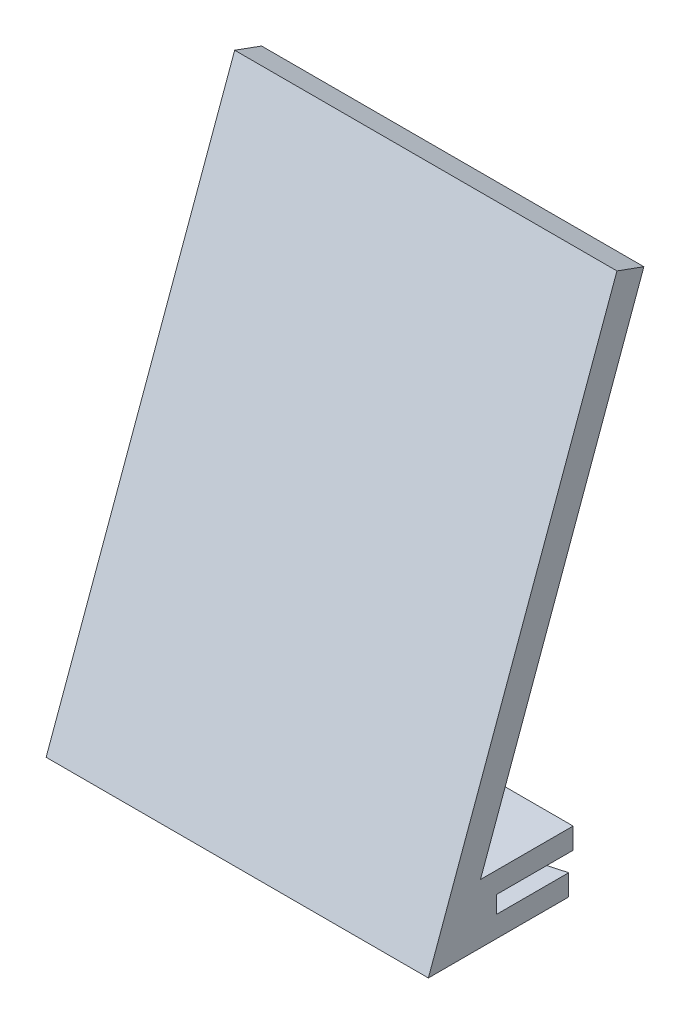
ISO-10303-21;
HEADER;
FILE_DESCRIPTION(('STEP AP214'),'2;1');
FILE_NAME('part.step','',(''),(''),'','','');
FILE_SCHEMA(('AUTOMOTIVE_DESIGN { 1 0 10303 214 1 1 1 1 }'));
ENDSEC;
DATA;
#1=APPLICATION_CONTEXT('core data for automotive mechanical design processes');
#2=APPLICATION_PROTOCOL_DEFINITION('international standard','automotive_design',2000,#1);
#3=PRODUCT_CONTEXT('',#1,'mechanical');
#4=PRODUCT('Part','Part','',(#3));
#5=PRODUCT_RELATED_PRODUCT_CATEGORY('part','',(#4));
#6=PRODUCT_DEFINITION_FORMATION('','',#4);
#7=PRODUCT_DEFINITION_CONTEXT('part definition',#1,'design');
#8=PRODUCT_DEFINITION('design','',#6,#7);
#9=PRODUCT_DEFINITION_SHAPE('','',#8);
#10=(LENGTH_UNIT() NAMED_UNIT(*) SI_UNIT(.MILLI.,.METRE.));
#11=(NAMED_UNIT(*) PLANE_ANGLE_UNIT() SI_UNIT($,.RADIAN.));
#12=(NAMED_UNIT(*) SI_UNIT($,.STERADIAN.) SOLID_ANGLE_UNIT());
#13=UNCERTAINTY_MEASURE_WITH_UNIT(LENGTH_MEASURE(1.E-05),#10,'distance_accuracy_value','');
#14=(GEOMETRIC_REPRESENTATION_CONTEXT(3) GLOBAL_UNCERTAINTY_ASSIGNED_CONTEXT((#13)) GLOBAL_UNIT_ASSIGNED_CONTEXT((#10,
#11,#12)) REPRESENTATION_CONTEXT('',''));
#15=CARTESIAN_POINT('',(0.,0.,0.));
#16=DIRECTION('',(0.,0.,1.));
#17=DIRECTION('',(1.,0.,0.));
#18=AXIS2_PLACEMENT_3D('',#15,#16,#17);
#19=CARTESIAN_POINT('',(-12.6688085137666,-76.9004215884673,0.));
#20=DIRECTION('',(0.,0.,-1.));
#21=DIRECTION('',(-1.,0.,0.));
#22=AXIS2_PLACEMENT_3D('',#19,#20,#21);
#23=PLANE('',#22);
#24=DIRECTION('',(0.,1.,0.));
#25=VECTOR('',#24,1.);
#26=CARTESIAN_POINT('',(7.33119148623341,-76.9004215884673,0.));
#27=LINE('',#26,#25);
#28=CARTESIAN_POINT('',(7.33119148623341,-78.9004215884673,0.));
#29=VERTEX_POINT('',#28);
#30=CARTESIAN_POINT('',(7.33119148623341,-78.0004215884673,0.));
#31=VERTEX_POINT('',#30);
#32=EDGE_CURVE('E125',#29,#31,#27,.T.);
#33=ORIENTED_EDGE('',*,*,#32,.F.);
#34=DIRECTION('',(1.,0.,0.));
#35=VECTOR('',#34,1.);
#36=CARTESIAN_POINT('',(0.,-78.9004215884673,0.));
#37=LINE('',#36,#35);
#38=CARTESIAN_POINT('',(-12.6688085137666,-78.9004215884673,0.));
#39=VERTEX_POINT('',#38);
#40=EDGE_CURVE('E149',#39,#29,#37,.T.);
#41=ORIENTED_EDGE('',*,*,#40,.F.);
#42=DIRECTION('',(0.,1.,0.));
#43=VECTOR('',#42,1.);
#44=CARTESIAN_POINT('',(-12.6688085137666,-76.9004215884673,0.));
#45=LINE('',#44,#43);
#46=CARTESIAN_POINT('',(-12.6688085137666,-78.0004215884673,0.));
#47=VERTEX_POINT('',#46);
#48=EDGE_CURVE('E169',#39,#47,#45,.T.);
#49=ORIENTED_EDGE('',*,*,#48,.T.);
#50=DIRECTION('',(1.,0.,0.));
#51=VECTOR('',#50,1.);
#52=CARTESIAN_POINT('',(0.,-78.0004215884673,0.));
#53=LINE('',#52,#51);
#54=EDGE_CURVE('E181',#47,#31,#53,.T.);
#55=ORIENTED_EDGE('',*,*,#54,.T.);
#56=EDGE_LOOP('',(#33,#41,#49,#55));
#57=FACE_BOUND('',#56,.T.);
#58=ADVANCED_FACE('F35',(#57),#23,.T.);
#59=CARTESIAN_POINT('',(-12.6688085137666,0.,-4.));
#60=DIRECTION('',(-1.,0.,0.));
#61=DIRECTION('',(0.,0.,1.));
#62=AXIS2_PLACEMENT_3D('',#59,#60,#61);
#63=PLANE('',#62);
#64=DIRECTION('',(0.,0.,1.));
#65=VECTOR('',#64,1.);
#66=CARTESIAN_POINT('',(-12.6688085137666,-78.0004215884673,-4.));
#67=LINE('',#66,#65);
#68=CARTESIAN_POINT('',(-12.6688085137666,-78.0004215884673,-4.));
#69=VERTEX_POINT('',#68);
#70=EDGE_CURVE('E39',#69,#47,#67,.T.);
#71=ORIENTED_EDGE('',*,*,#70,.T.);
#72=ORIENTED_EDGE('',*,*,#48,.F.);
#73=DIRECTION('',(0.,0.,1.));
#74=VECTOR('',#73,1.);
#75=CARTESIAN_POINT('',(-12.6688085137666,-78.9004215884673,-4.));
#76=LINE('',#75,#74);
#77=CARTESIAN_POINT('',(-12.6688085137666,-78.9004215884673,-3.76904832129353));
#78=VERTEX_POINT('',#77);
#79=EDGE_CURVE('E153',#78,#39,#76,.T.);
#80=ORIENTED_EDGE('',*,*,#79,.F.);
#81=DIRECTION('',(0.,-1.,0.));
#82=VECTOR('',#81,1.);
#83=CARTESIAN_POINT('',(-12.6688085137666,-76.8994215884673,-3.76904832129353));
#84=LINE('',#83,#82);
#85=CARTESIAN_POINT('',(-12.6688085137666,-80.0004215884673,-3.76904832129353));
#86=VERTEX_POINT('',#85);
#87=EDGE_CURVE('E146',#78,#86,#84,.T.);
#88=ORIENTED_EDGE('',*,*,#87,.T.);
#89=DIRECTION('',(0.,0.,-1.));
#90=VECTOR('',#89,1.);
#91=CARTESIAN_POINT('',(-12.6688085137666,-80.0004215884673,0.));
#92=LINE('',#91,#90);
#93=CARTESIAN_POINT('',(-12.6688085137666,-80.0004215884673,3.57176217022879));
#94=VERTEX_POINT('',#93);
#95=EDGE_CURVE('E167',#94,#86,#92,.T.);
#96=ORIENTED_EDGE('',*,*,#95,.F.);
#97=DIRECTION('',(0.,-0.939692620785907,0.342020143325672));
#98=VECTOR('',#97,1.);
#99=CARTESIAN_POINT('',(-12.6688085137666,-80.0004215884673,3.57176217022879));
#100=LINE('',#99,#98);
#101=CARTESIAN_POINT('',(-12.6688085137666,-52.8950758538311,-6.29377686667327));
#102=VERTEX_POINT('',#101);
#103=EDGE_CURVE('E164',#102,#94,#100,.T.);
#104=ORIENTED_EDGE('',*,*,#103,.F.);
#105=DIRECTION('',(0.,0.342020143325674,0.939692620785906));
#106=VECTOR('',#105,1.);
#107=CARTESIAN_POINT('',(-12.6688085137666,-52.8950758538311,-6.29377686667327));
#108=LINE('',#107,#106);
#109=CARTESIAN_POINT('',(-12.6688085137666,-53.4081060688196,-7.70331579785213));
#110=VERTEX_POINT('',#109);
#111=EDGE_CURVE('E161',#110,#102,#108,.T.);
#112=ORIENTED_EDGE('',*,*,#111,.F.);
#113=DIRECTION('',(0.,0.939692620785907,-0.342020143325673));
#114=VECTOR('',#113,1.);
#115=CARTESIAN_POINT('',(-12.6688085137666,-53.4081060688196,-7.70331579785213));
#116=LINE('',#115,#114);
#117=CARTESIAN_POINT('',(-12.6688085137666,-76.9004215884673,0.847187785289687));
#118=VERTEX_POINT('',#117);
#119=EDGE_CURVE('E158',#118,#110,#116,.T.);
#120=ORIENTED_EDGE('',*,*,#119,.F.);
#121=DIRECTION('',(0.,0.,1.));
#122=VECTOR('',#121,1.);
#123=CARTESIAN_POINT('',(-12.6688085137666,-76.9004215884673,-4.));
#124=LINE('',#123,#122);
#125=CARTESIAN_POINT('',(-12.6688085137666,-76.9004215884673,-4.));
#126=VERTEX_POINT('',#125);
#127=EDGE_CURVE('E11',#126,#118,#124,.T.);
#128=ORIENTED_EDGE('',*,*,#127,.F.);
#129=DIRECTION('',(0.,-1.,0.));
#130=VECTOR('',#129,1.);
#131=CARTESIAN_POINT('',(-12.6688085137666,0.,-4.));
#132=LINE('',#131,#130);
#133=EDGE_CURVE('E188',#126,#69,#132,.T.);
#134=ORIENTED_EDGE('',*,*,#133,.T.);
#135=EDGE_LOOP('',(#71,#72,#80,#88,#96,#104,#112,#120,#128,#134));
#136=FACE_BOUND('',#135,.T.);
#137=ADVANCED_FACE('F37',(#136),#63,.T.);
#138=CARTESIAN_POINT('',(0.,-76.9004215884673,-4.));
#139=DIRECTION('',(0.,1.,0.));
#140=DIRECTION('',(0.,0.,1.));
#141=AXIS2_PLACEMENT_3D('',#138,#139,#140);
#142=PLANE('',#141);
#143=ORIENTED_EDGE('',*,*,#127,.T.);
#144=DIRECTION('',(1.,0.,0.));
#145=VECTOR('',#144,1.);
#146=CARTESIAN_POINT('',(-12.6688085137666,-76.9004215884673,0.847187785289687));
#147=LINE('',#146,#145);
#148=CARTESIAN_POINT('',(7.33119148623341,-76.9004215884673,0.847187785289687));
#149=VERTEX_POINT('',#148);
#150=EDGE_CURVE('E171',#118,#149,#147,.T.);
#151=ORIENTED_EDGE('',*,*,#150,.T.);
#152=DIRECTION('',(0.,0.,1.));
#153=VECTOR('',#152,1.);
#154=CARTESIAN_POINT('',(7.33119148623341,-76.9004215884673,-4.));
#155=LINE('',#154,#153);
#156=CARTESIAN_POINT('',(7.33119148623341,-76.9004215884673,-4.));
#157=VERTEX_POINT('',#156);
#158=EDGE_CURVE('E45',#157,#149,#155,.T.);
#159=ORIENTED_EDGE('',*,*,#158,.F.);
#160=DIRECTION('',(-1.,0.,0.));
#161=VECTOR('',#160,1.);
#162=CARTESIAN_POINT('',(0.,-76.9004215884673,-4.));
#163=LINE('',#162,#161);
#164=EDGE_CURVE('E195',#157,#126,#163,.T.);
#165=ORIENTED_EDGE('',*,*,#164,.T.);
#166=EDGE_LOOP('',(#143,#151,#159,#165));
#167=FACE_BOUND('',#166,.T.);
#168=ADVANCED_FACE('F235',(#167),#142,.T.);
#169=CARTESIAN_POINT('',(7.33119148623341,0.,-4.));
#170=DIRECTION('',(-1.,0.,0.));
#171=DIRECTION('',(0.,0.,1.));
#172=AXIS2_PLACEMENT_3D('',#169,#170,#171);
#173=PLANE('',#172);
#174=ORIENTED_EDGE('',*,*,#158,.T.);
#175=DIRECTION('',(0.,0.939692620785907,-0.342020143325673));
#176=VECTOR('',#175,1.);
#177=CARTESIAN_POINT('',(7.33119148623341,-53.4081060688196,-7.70331579785213));
#178=LINE('',#177,#176);
#179=CARTESIAN_POINT('',(7.33119148623341,-53.4081060688196,-7.70331579785213));
#180=VERTEX_POINT('',#179);
#181=EDGE_CURVE('E156',#149,#180,#178,.T.);
#182=ORIENTED_EDGE('',*,*,#181,.T.);
#183=DIRECTION('',(0.,0.342020143325674,0.939692620785906));
#184=VECTOR('',#183,1.);
#185=CARTESIAN_POINT('',(7.33119148623341,-52.8950758538311,-6.29377686667327));
#186=LINE('',#185,#184);
#187=CARTESIAN_POINT('',(7.33119148623341,-52.8950758538311,-6.29377686667327));
#188=VERTEX_POINT('',#187);
#189=EDGE_CURVE('E174',#180,#188,#186,.T.);
#190=ORIENTED_EDGE('',*,*,#189,.T.);
#191=DIRECTION('',(0.,-0.939692620785907,0.342020143325672));
#192=VECTOR('',#191,1.);
#193=CARTESIAN_POINT('',(7.33119148623341,-80.0004215884673,3.57176217022879));
#194=LINE('',#193,#192);
#195=CARTESIAN_POINT('',(7.33119148623341,-80.0004215884673,3.57176217022879));
#196=VERTEX_POINT('',#195);
#197=EDGE_CURVE('E122',#188,#196,#194,.T.);
#198=ORIENTED_EDGE('',*,*,#197,.T.);
#199=DIRECTION('',(0.,0.,-1.));
#200=VECTOR('',#199,1.);
#201=CARTESIAN_POINT('',(7.33119148623341,-80.0004215884673,0.));
#202=LINE('',#201,#200);
#203=CARTESIAN_POINT('',(7.33119148623342,-80.0004215884673,-3.76904832129353));
#204=VERTEX_POINT('',#203);
#205=EDGE_CURVE('E115',#196,#204,#202,.T.);
#206=ORIENTED_EDGE('',*,*,#205,.T.);
#207=DIRECTION('',(0.,-1.,0.));
#208=VECTOR('',#207,1.);
#209=CARTESIAN_POINT('',(7.33119148623342,-76.8994215884673,-3.76904832129353));
#210=LINE('',#209,#208);
#211=CARTESIAN_POINT('',(7.33119148623342,-78.9004215884673,-3.76904832129353));
#212=VERTEX_POINT('',#211);
#213=EDGE_CURVE('E118',#212,#204,#210,.T.);
#214=ORIENTED_EDGE('',*,*,#213,.F.);
#215=DIRECTION('',(0.,0.,1.));
#216=VECTOR('',#215,1.);
#217=CARTESIAN_POINT('',(7.33119148623341,-78.9004215884673,-4.));
#218=LINE('',#217,#216);
#219=EDGE_CURVE('E154',#212,#29,#218,.T.);
#220=ORIENTED_EDGE('',*,*,#219,.T.);
#221=ORIENTED_EDGE('',*,*,#32,.T.);
#222=DIRECTION('',(0.,0.,1.));
#223=VECTOR('',#222,1.);
#224=CARTESIAN_POINT('',(7.33119148623341,-78.0004215884673,-4.));
#225=LINE('',#224,#223);
#226=CARTESIAN_POINT('',(7.33119148623341,-78.0004215884673,-4.));
#227=VERTEX_POINT('',#226);
#228=EDGE_CURVE('E200',#227,#31,#225,.T.);
#229=ORIENTED_EDGE('',*,*,#228,.F.);
#230=DIRECTION('',(0.,-1.,0.));
#231=VECTOR('',#230,1.);
#232=CARTESIAN_POINT('',(7.33119148623341,0.,-4.));
#233=LINE('',#232,#231);
#234=EDGE_CURVE('E193',#157,#227,#233,.T.);
#235=ORIENTED_EDGE('',*,*,#234,.F.);
#236=EDGE_LOOP('',(#174,#182,#190,#198,#206,#214,#220,#221,#229,#235));
#237=FACE_BOUND('',#236,.T.);
#238=ADVANCED_FACE('F117',(#237),#173,.F.);
#239=CARTESIAN_POINT('',(0.,-78.0004215884673,-4.));
#240=DIRECTION('',(0.,-1.,0.));
#241=DIRECTION('',(0.,0.,-1.));
#242=AXIS2_PLACEMENT_3D('',#239,#240,#241);
#243=PLANE('',#242);
#244=ORIENTED_EDGE('',*,*,#54,.F.);
#245=ORIENTED_EDGE('',*,*,#70,.F.);
#246=DIRECTION('',(1.,0.,0.));
#247=VECTOR('',#246,1.);
#248=CARTESIAN_POINT('',(0.,-78.0004215884673,-4.));
#249=LINE('',#248,#247);
#250=EDGE_CURVE('E190',#69,#227,#249,.T.);
#251=ORIENTED_EDGE('',*,*,#250,.T.);
#252=ORIENTED_EDGE('',*,*,#228,.T.);
#253=EDGE_LOOP('',(#244,#245,#251,#252));
#254=FACE_BOUND('',#253,.T.);
#255=ADVANCED_FACE('F209',(#254),#243,.T.);
#256=CARTESIAN_POINT('',(0.,0.,-4.));
#257=DIRECTION('',(0.,0.,1.));
#258=DIRECTION('',(1.,0.,0.));
#259=AXIS2_PLACEMENT_3D('',#256,#257,#258);
#260=PLANE('',#259);
#261=ORIENTED_EDGE('',*,*,#133,.F.);
#262=ORIENTED_EDGE('',*,*,#164,.F.);
#263=ORIENTED_EDGE('',*,*,#234,.T.);
#264=ORIENTED_EDGE('',*,*,#250,.F.);
#265=EDGE_LOOP('',(#261,#262,#263,#264));
#266=FACE_BOUND('',#265,.T.);
#267=ADVANCED_FACE('F240',(#266),#260,.F.);
#268=CARTESIAN_POINT('',(-12.6688085137666,-80.0004215884673,0.));
#269=DIRECTION('',(0.,-1.,0.));
#270=DIRECTION('',(0.,0.,-1.));
#271=AXIS2_PLACEMENT_3D('',#268,#269,#270);
#272=PLANE('',#271);
#273=ORIENTED_EDGE('',*,*,#205,.F.);
#274=DIRECTION('',(1.,0.,0.));
#275=VECTOR('',#274,1.);
#276=CARTESIAN_POINT('',(-12.6688085137666,-80.0004215884673,3.57176217022879));
#277=LINE('',#276,#275);
#278=EDGE_CURVE('E179',#94,#196,#277,.T.);
#279=ORIENTED_EDGE('',*,*,#278,.F.);
#280=ORIENTED_EDGE('',*,*,#95,.T.);
#281=DIRECTION('',(-0.965363393028266,0.,-0.260909025142775));
#282=VECTOR('',#281,1.);
#283=CARTESIAN_POINT('',(0.0869074387351588,-80.0004215884673,-0.321557523320087));
#284=LINE('',#283,#282);
#285=CARTESIAN_POINT('',(-2.66880851376659,-80.0004215884673,-1.06634561859083));
#286=VERTEX_POINT('',#285);
#287=EDGE_CURVE('E135',#286,#86,#284,.T.);
#288=ORIENTED_EDGE('',*,*,#287,.F.);
#289=DIRECTION('',(-0.965363393028266,0.,0.260909025142775));
#290=VECTOR('',#289,1.);
#291=CARTESIAN_POINT('',(-0.450257815013796,-80.0004215884673,-1.66595391555104));
#292=LINE('',#291,#290);
#293=EDGE_CURVE('E130',#204,#286,#292,.T.);
#294=ORIENTED_EDGE('',*,*,#293,.F.);
#295=EDGE_LOOP('',(#273,#279,#280,#288,#294));
#296=FACE_BOUND('',#295,.T.);
#297=ADVANCED_FACE('F137',(#296),#272,.T.);
#298=CARTESIAN_POINT('',(-12.6688085137666,-80.0004215884673,3.57176217022879));
#299=DIRECTION('',(0.,0.342020143325672,0.939692620785907));
#300=DIRECTION('',(0.,-0.939692620785907,0.342020143325672));
#301=AXIS2_PLACEMENT_3D('',#298,#299,#300);
#302=PLANE('',#301);
#303=ORIENTED_EDGE('',*,*,#197,.F.);
#304=DIRECTION('',(1.,0.,0.));
#305=VECTOR('',#304,1.);
#306=CARTESIAN_POINT('',(-12.6688085137666,-52.8950758538311,-6.29377686667327));
#307=LINE('',#306,#305);
#308=EDGE_CURVE('E182',#102,#188,#307,.T.);
#309=ORIENTED_EDGE('',*,*,#308,.F.);
#310=ORIENTED_EDGE('',*,*,#103,.T.);
#311=ORIENTED_EDGE('',*,*,#278,.T.);
#312=EDGE_LOOP('',(#303,#309,#310,#311));
#313=FACE_BOUND('',#312,.T.);
#314=ADVANCED_FACE('F239',(#313),#302,.T.);
#315=CARTESIAN_POINT('',(-12.6688085137666,-52.8950758538311,-6.29377686667327));
#316=DIRECTION('',(0.,0.939692620785906,-0.342020143325674));
#317=DIRECTION('',(0.,0.342020143325674,0.939692620785907));
#318=AXIS2_PLACEMENT_3D('',#315,#316,#317);
#319=PLANE('',#318);
#320=ORIENTED_EDGE('',*,*,#189,.F.);
#321=DIRECTION('',(1.,0.,0.));
#322=VECTOR('',#321,1.);
#323=CARTESIAN_POINT('',(-12.6688085137666,-53.4081060688196,-7.70331579785213));
#324=LINE('',#323,#322);
#325=EDGE_CURVE('E184',#110,#180,#324,.T.);
#326=ORIENTED_EDGE('',*,*,#325,.F.);
#327=ORIENTED_EDGE('',*,*,#111,.T.);
#328=ORIENTED_EDGE('',*,*,#308,.T.);
#329=EDGE_LOOP('',(#320,#326,#327,#328));
#330=FACE_BOUND('',#329,.T.);
#331=ADVANCED_FACE('F243',(#330),#319,.T.);
#332=CARTESIAN_POINT('',(-12.6688085137666,-53.4081060688196,-7.70331579785213));
#333=DIRECTION('',(0.,-0.342020143325673,-0.939692620785907));
#334=DIRECTION('',(0.,0.939692620785907,-0.342020143325673));
#335=AXIS2_PLACEMENT_3D('',#332,#333,#334);
#336=PLANE('',#335);
#337=ORIENTED_EDGE('',*,*,#181,.F.);
#338=ORIENTED_EDGE('',*,*,#150,.F.);
#339=ORIENTED_EDGE('',*,*,#119,.T.);
#340=ORIENTED_EDGE('',*,*,#325,.T.);
#341=EDGE_LOOP('',(#337,#338,#339,#340));
#342=FACE_BOUND('',#341,.T.);
#343=ADVANCED_FACE('F228',(#342),#336,.T.);
#344=CARTESIAN_POINT('',(0.,-78.9004215884673,-4.));
#345=DIRECTION('',(0.,-1.,0.));
#346=DIRECTION('',(0.,0.,-1.));
#347=AXIS2_PLACEMENT_3D('',#344,#345,#346);
#348=PLANE('',#347);
#349=DIRECTION('',(0.965363393028266,0.,-0.260909025142775));
#350=VECTOR('',#349,1.);
#351=CARTESIAN_POINT('',(-0.450257815013796,-78.9004215884673,-1.66595391555104));
#352=LINE('',#351,#350);
#353=CARTESIAN_POINT('',(-2.66880851376659,-78.9004215884673,-1.06634561859083));
#354=VERTEX_POINT('',#353);
#355=EDGE_CURVE('E133',#354,#212,#352,.T.);
#356=ORIENTED_EDGE('',*,*,#355,.F.);
#357=DIRECTION('',(0.965363393028266,0.,0.260909025142775));
#358=VECTOR('',#357,1.);
#359=CARTESIAN_POINT('',(0.0869074387351588,-78.9004215884673,-0.321557523320087));
#360=LINE('',#359,#358);
#361=EDGE_CURVE('E139',#78,#354,#360,.T.);
#362=ORIENTED_EDGE('',*,*,#361,.F.);
#363=ORIENTED_EDGE('',*,*,#79,.T.);
#364=ORIENTED_EDGE('',*,*,#40,.T.);
#365=ORIENTED_EDGE('',*,*,#219,.F.);
#366=EDGE_LOOP('',(#356,#362,#363,#364,#365));
#367=FACE_BOUND('',#366,.T.);
#368=ADVANCED_FACE('F215',(#367),#348,.F.);
#369=CARTESIAN_POINT('',(0.0869074387351588,-76.8994215884673,-0.321557523320087));
#370=DIRECTION('',(-0.260909025142775,0.,0.965363393028266));
#371=DIRECTION('',(0.965363393028266,0.,0.260909025142775));
#372=AXIS2_PLACEMENT_3D('',#369,#370,#371);
#373=PLANE('',#372);
#374=ORIENTED_EDGE('',*,*,#361,.T.);
#375=DIRECTION('',(0.,-1.,0.));
#376=VECTOR('',#375,1.);
#377=CARTESIAN_POINT('',(-2.66880851376659,-76.8994215884673,-1.06634561859083));
#378=LINE('',#377,#376);
#379=EDGE_CURVE('E134',#354,#286,#378,.T.);
#380=ORIENTED_EDGE('',*,*,#379,.T.);
#381=ORIENTED_EDGE('',*,*,#287,.T.);
#382=ORIENTED_EDGE('',*,*,#87,.F.);
#383=EDGE_LOOP('',(#374,#380,#381,#382));
#384=FACE_BOUND('',#383,.T.);
#385=ADVANCED_FACE('F220',(#384),#373,.F.);
#386=CARTESIAN_POINT('',(-0.450257815013796,-76.8994215884673,-1.66595391555104));
#387=DIRECTION('',(0.260909025142775,0.,0.965363393028266));
#388=DIRECTION('',(0.965363393028266,0.,-0.260909025142775));
#389=AXIS2_PLACEMENT_3D('',#386,#387,#388);
#390=PLANE('',#389);
#391=ORIENTED_EDGE('',*,*,#355,.T.);
#392=ORIENTED_EDGE('',*,*,#213,.T.);
#393=ORIENTED_EDGE('',*,*,#293,.T.);
#394=ORIENTED_EDGE('',*,*,#379,.F.);
#395=EDGE_LOOP('',(#391,#392,#393,#394));
#396=FACE_BOUND('',#395,.T.);
#397=ADVANCED_FACE('F129',(#396),#390,.F.);
#398=CLOSED_SHELL('',(#58,#137,#168,#238,#255,#267,#297,#314,#331,#343,#368,#385,#397));
#399=MANIFOLD_SOLID_BREP('B2',#398);
#400=ADVANCED_BREP_SHAPE_REPRESENTATION('',(#18,#399),#14);
#401=SHAPE_DEFINITION_REPRESENTATION(#9,#400);
ENDSEC;
END-ISO-10303-21;
